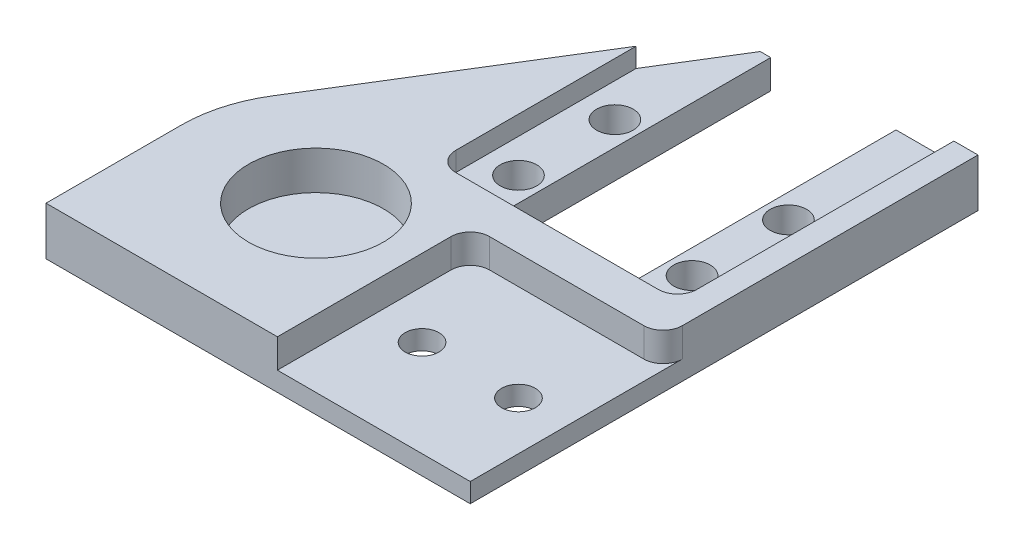
ISO-10303-21;
HEADER;
FILE_DESCRIPTION(('STEP AP214'),'2;1');
FILE_NAME('part.step','',(''),(''),'','','');
FILE_SCHEMA(('AUTOMOTIVE_DESIGN { 1 0 10303 214 1 1 1 1 }'));
ENDSEC;
DATA;
#1=APPLICATION_CONTEXT('core data for automotive mechanical design processes');
#2=APPLICATION_PROTOCOL_DEFINITION('international standard','automotive_design',2000,#1);
#3=PRODUCT_CONTEXT('',#1,'mechanical');
#4=PRODUCT('Part','Part','',(#3));
#5=PRODUCT_RELATED_PRODUCT_CATEGORY('part','',(#4));
#6=PRODUCT_DEFINITION_FORMATION('','',#4);
#7=PRODUCT_DEFINITION_CONTEXT('part definition',#1,'design');
#8=PRODUCT_DEFINITION('design','',#6,#7);
#9=PRODUCT_DEFINITION_SHAPE('','',#8);
#10=(LENGTH_UNIT() NAMED_UNIT(*) SI_UNIT(.MILLI.,.METRE.));
#11=(NAMED_UNIT(*) PLANE_ANGLE_UNIT() SI_UNIT($,.RADIAN.));
#12=(NAMED_UNIT(*) SI_UNIT($,.STERADIAN.) SOLID_ANGLE_UNIT());
#13=UNCERTAINTY_MEASURE_WITH_UNIT(LENGTH_MEASURE(1.E-05),#10,'distance_accuracy_value','');
#14=(GEOMETRIC_REPRESENTATION_CONTEXT(3) GLOBAL_UNCERTAINTY_ASSIGNED_CONTEXT((#13)) GLOBAL_UNIT_ASSIGNED_CONTEXT((#10,
#11,#12)) REPRESENTATION_CONTEXT('',''));
#15=CARTESIAN_POINT('',(0.,0.,0.));
#16=DIRECTION('',(0.,0.,1.));
#17=DIRECTION('',(1.,0.,0.));
#18=AXIS2_PLACEMENT_3D('',#15,#16,#17);
#19=CARTESIAN_POINT('',(121.75,7.,-9.));
#20=DIRECTION('',(0.,1.,0.));
#21=DIRECTION('',(0.,0.,1.));
#22=AXIS2_PLACEMENT_3D('',#19,#20,#21);
#23=PLANE('',#22);
#24=DIRECTION('',(1.,0.,0.));
#25=VECTOR('',#24,1.);
#26=CARTESIAN_POINT('',(-38.25,7.,-22.25));
#27=LINE('',#26,#25);
#28=CARTESIAN_POINT('',(-36.25,7.,-22.25));
#29=VERTEX_POINT('',#28);
#30=CARTESIAN_POINT('',(-20.25,7.,-22.25));
#31=VERTEX_POINT('',#30);
#32=EDGE_CURVE('E226',#29,#31,#27,.T.);
#33=ORIENTED_EDGE('',*,*,#32,.T.);
#34=CARTESIAN_POINT('',(-20.25,7.,-24.25));
#35=DIRECTION('',(0.,1.,0.));
#36=DIRECTION('',(0.,0.,1.));
#37=AXIS2_PLACEMENT_3D('',#34,#35,#36);
#38=CIRCLE('',#37,2.);
#39=CARTESIAN_POINT('',(-18.25,7.,-24.25));
#40=VERTEX_POINT('',#39);
#41=EDGE_CURVE('E397',#31,#40,#38,.T.);
#42=ORIENTED_EDGE('',*,*,#41,.T.);
#43=DIRECTION('',(0.,0.,-1.));
#44=VECTOR('',#43,1.);
#45=CARTESIAN_POINT('',(-18.25,7.,-8.99999999999998));
#46=LINE('',#45,#44);
#47=CARTESIAN_POINT('',(-18.25,7.,-54.9089848359276));
#48=VERTEX_POINT('',#47);
#49=EDGE_CURVE('E231',#40,#48,#46,.T.);
#50=ORIENTED_EDGE('',*,*,#49,.T.);
#51=DIRECTION('',(1.,0.,0.));
#52=VECTOR('',#51,1.);
#53=CARTESIAN_POINT('',(-62.25,7.,-54.9089848359276));
#54=LINE('',#53,#52);
#55=CARTESIAN_POINT('',(-20.75,7.,-54.9089848359276));
#56=VERTEX_POINT('',#55);
#57=EDGE_CURVE('E233',#56,#48,#54,.T.);
#58=ORIENTED_EDGE('',*,*,#57,.F.);
#59=DIRECTION('',(0.,0.,1.));
#60=VECTOR('',#59,1.);
#61=CARTESIAN_POINT('',(-20.75,7.,-9.));
#62=LINE('',#61,#60);
#63=CARTESIAN_POINT('',(-20.75,7.,-28.25));
#64=VERTEX_POINT('',#63);
#65=EDGE_CURVE('E301',#56,#64,#62,.T.);
#66=ORIENTED_EDGE('',*,*,#65,.T.);
#67=CARTESIAN_POINT('',(-22.75,7.,-28.25));
#68=DIRECTION('',(0.,1.,0.));
#69=DIRECTION('',(0.,0.,1.));
#70=AXIS2_PLACEMENT_3D('',#67,#68,#69);
#71=CIRCLE('',#70,2.);
#72=CARTESIAN_POINT('',(-22.75,7.,-26.25));
#73=VERTEX_POINT('',#72);
#74=EDGE_CURVE('E379',#64,#73,#71,.F.);
#75=ORIENTED_EDGE('',*,*,#74,.T.);
#76=DIRECTION('',(1.,0.,0.));
#77=VECTOR('',#76,1.);
#78=CARTESIAN_POINT('',(121.75,7.,-26.25));
#79=LINE('',#78,#77);
#80=CARTESIAN_POINT('',(-43.75,7.,-26.25));
#81=VERTEX_POINT('',#80);
#82=EDGE_CURVE('E330',#81,#73,#79,.T.);
#83=ORIENTED_EDGE('',*,*,#82,.F.);
#84=CARTESIAN_POINT('',(-43.75,7.,-28.25));
#85=DIRECTION('',(0.,1.,0.));
#86=DIRECTION('',(0.,0.,1.));
#87=AXIS2_PLACEMENT_3D('',#84,#85,#86);
#88=CIRCLE('',#87,2.);
#89=CARTESIAN_POINT('',(-45.75,7.,-28.25));
#90=VERTEX_POINT('',#89);
#91=EDGE_CURVE('E390',#81,#90,#88,.F.);
#92=ORIENTED_EDGE('',*,*,#91,.T.);
#93=DIRECTION('',(0.,0.,-1.));
#94=VECTOR('',#93,1.);
#95=CARTESIAN_POINT('',(-45.75,7.,-9.));
#96=LINE('',#95,#94);
#97=CARTESIAN_POINT('',(-45.75,7.,-46.9436745409189));
#98=VERTEX_POINT('',#97);
#99=EDGE_CURVE('E352',#90,#98,#96,.T.);
#100=ORIENTED_EDGE('',*,*,#99,.T.);
#101=DIRECTION('',(-0.525421149026402,0.,0.850842298052803));
#102=VECTOR('',#101,1.);
#103=CARTESIAN_POINT('',(-34.4694758388832,7.,-65.2108248417198));
#104=LINE('',#103,#102);
#105=CARTESIAN_POINT('',(-60.1617921727393,7.,-23.6058960863696));
#106=VERTEX_POINT('',#105);
#107=EDGE_CURVE('E338',#98,#106,#104,.T.);
#108=ORIENTED_EDGE('',*,*,#107,.T.);
#109=CARTESIAN_POINT('',(-48.25,7.,-16.25));
#110=DIRECTION('',(0.,1.,0.));
#111=DIRECTION('',(0.,0.,1.));
#112=AXIS2_PLACEMENT_3D('',#109,#110,#111);
#113=CIRCLE('',#112,14.);
#114=CARTESIAN_POINT('',(-62.25,7.,-16.25));
#115=VERTEX_POINT('',#114);
#116=EDGE_CURVE('E340',#106,#115,#113,.T.);
#117=ORIENTED_EDGE('',*,*,#116,.T.);
#118=DIRECTION('',(0.,0.,1.));
#119=VECTOR('',#118,1.);
#120=CARTESIAN_POINT('',(-62.25,7.,-16.25));
#121=LINE('',#120,#119);
#122=CARTESIAN_POINT('',(-62.25,7.,-2.25));
#123=VERTEX_POINT('',#122);
#124=EDGE_CURVE('E333',#115,#123,#121,.T.);
#125=ORIENTED_EDGE('',*,*,#124,.T.);
#126=DIRECTION('',(1.,0.,0.));
#127=VECTOR('',#126,1.);
#128=CARTESIAN_POINT('',(-62.25,7.,-2.25));
#129=LINE('',#128,#127);
#130=CARTESIAN_POINT('',(-38.25,7.,-2.24999999999999));
#131=VERTEX_POINT('',#130);
#132=EDGE_CURVE('E336',#123,#131,#129,.T.);
#133=ORIENTED_EDGE('',*,*,#132,.T.);
#134=DIRECTION('',(0.,0.,1.));
#135=VECTOR('',#134,1.);
#136=CARTESIAN_POINT('',(-38.25,7.,-2.24999999999999));
#137=LINE('',#136,#135);
#138=CARTESIAN_POINT('',(-38.25,7.,-20.25));
#139=VERTEX_POINT('',#138);
#140=EDGE_CURVE('E209',#139,#131,#137,.T.);
#141=ORIENTED_EDGE('',*,*,#140,.F.);
#142=CARTESIAN_POINT('',(-36.25,7.,-20.25));
#143=DIRECTION('',(0.,1.,0.));
#144=DIRECTION('',(0.,0.,1.));
#145=AXIS2_PLACEMENT_3D('',#142,#143,#144);
#146=CIRCLE('',#145,2.);
#147=EDGE_CURVE('E12',#139,#29,#146,.F.);
#148=ORIENTED_EDGE('',*,*,#147,.T.);
#149=EDGE_LOOP('',(#33,#42,#50,#58,#66,#75,#83,#92,#100,#108,#117,#125,#133,#141,#148));
#150=FACE_BOUND('',#149,.T.);
#151=CARTESIAN_POINT('',(-48.25,7.,-16.25));
#152=DIRECTION('',(0.,1.,0.));
#153=DIRECTION('',(0.,0.,1.));
#154=AXIS2_PLACEMENT_3D('',#151,#152,#153);
#155=CIRCLE('',#154,7.);
#156=CARTESIAN_POINT('',(-48.25,7.,-9.25));
#157=VERTEX_POINT('',#156);
#158=EDGE_CURVE('E282',#157,#157,#155,.T.);
#159=ORIENTED_EDGE('',*,*,#158,.F.);
#160=EDGE_LOOP('',(#159));
#161=FACE_BOUND('',#160,.T.);
#162=ADVANCED_FACE('F50',(#150,#161),#23,.T.);
#163=CARTESIAN_POINT('',(0.,4.,-2.25));
#164=DIRECTION('',(0.,0.,-1.));
#165=DIRECTION('',(-1.,0.,0.));
#166=AXIS2_PLACEMENT_3D('',#163,#164,#165);
#167=PLANE('',#166);
#168=DIRECTION('',(0.,1.,0.));
#169=VECTOR('',#168,1.);
#170=CARTESIAN_POINT('',(-18.25,2.,-2.25));
#171=LINE('',#170,#169);
#172=CARTESIAN_POINT('',(-18.25,2.,-2.25));
#173=VERTEX_POINT('',#172);
#174=CARTESIAN_POINT('',(-18.25,4.,-2.25));
#175=VERTEX_POINT('',#174);
#176=EDGE_CURVE('E222',#173,#175,#171,.T.);
#177=ORIENTED_EDGE('',*,*,#176,.T.);
#178=DIRECTION('',(1.,0.,0.));
#179=VECTOR('',#178,1.);
#180=CARTESIAN_POINT('',(-38.25,4.,-2.25));
#181=LINE('',#180,#179);
#182=CARTESIAN_POINT('',(-38.25,4.,-2.25));
#183=VERTEX_POINT('',#182);
#184=EDGE_CURVE('E205',#183,#175,#181,.T.);
#185=ORIENTED_EDGE('',*,*,#184,.F.);
#186=DIRECTION('',(0.,-1.,0.));
#187=VECTOR('',#186,1.);
#188=CARTESIAN_POINT('',(-38.25,7.,-2.24999999999999));
#189=LINE('',#188,#187);
#190=EDGE_CURVE('E210',#131,#183,#189,.T.);
#191=ORIENTED_EDGE('',*,*,#190,.F.);
#192=ORIENTED_EDGE('',*,*,#132,.F.);
#193=DIRECTION('',(0.,-1.,0.));
#194=VECTOR('',#193,1.);
#195=CARTESIAN_POINT('',(-62.25,7.,-2.25));
#196=LINE('',#195,#194);
#197=CARTESIAN_POINT('',(-62.25,2.,-2.25));
#198=VERTEX_POINT('',#197);
#199=EDGE_CURVE('E343',#123,#198,#196,.T.);
#200=ORIENTED_EDGE('',*,*,#199,.T.);
#201=DIRECTION('',(-1.,0.,0.));
#202=VECTOR('',#201,1.);
#203=CARTESIAN_POINT('',(0.,2.,-2.25));
#204=LINE('',#203,#202);
#205=EDGE_CURVE('E317',#173,#198,#204,.T.);
#206=ORIENTED_EDGE('',*,*,#205,.F.);
#207=EDGE_LOOP('',(#177,#185,#191,#192,#200,#206));
#208=FACE_BOUND('',#207,.T.);
#209=ADVANCED_FACE('F219',(#208),#167,.F.);
#210=CARTESIAN_POINT('',(-26.75,23.,-64.4306069155303));
#211=DIRECTION('',(1.,0.,0.));
#212=DIRECTION('',(0.,0.,-1.));
#213=AXIS2_PLACEMENT_3D('',#210,#211,#212);
#214=PLANE('',#213);
#215=DIRECTION('',(0.,0.,-1.));
#216=VECTOR('',#215,1.);
#217=CARTESIAN_POINT('',(-26.75,2.,0.));
#218=LINE('',#217,#216);
#219=CARTESIAN_POINT('',(-26.75,2.,-28.25));
#220=VERTEX_POINT('',#219);
#221=CARTESIAN_POINT('',(-26.75,2.,-54.9089848359276));
#222=VERTEX_POINT('',#221);
#223=EDGE_CURVE('E313',#220,#222,#218,.T.);
#224=ORIENTED_EDGE('',*,*,#223,.F.);
#225=DIRECTION('',(0.,-1.,0.));
#226=VECTOR('',#225,1.);
#227=CARTESIAN_POINT('',(-26.75,5.,-28.25));
#228=LINE('',#227,#226);
#229=CARTESIAN_POINT('',(-26.75,5.,-28.25));
#230=VERTEX_POINT('',#229);
#231=EDGE_CURVE('E369',#220,#230,#228,.F.);
#232=ORIENTED_EDGE('',*,*,#231,.T.);
#233=DIRECTION('',(0.,0.,1.));
#234=VECTOR('',#233,1.);
#235=CARTESIAN_POINT('',(-26.75,5.,-64.4306069155303));
#236=LINE('',#235,#234);
#237=CARTESIAN_POINT('',(-26.75,5.,-54.9089848359276));
#238=VERTEX_POINT('',#237);
#239=EDGE_CURVE('E349',#238,#230,#236,.T.);
#240=ORIENTED_EDGE('',*,*,#239,.F.);
#241=DIRECTION('',(0.,1.,0.));
#242=VECTOR('',#241,1.);
#243=CARTESIAN_POINT('',(-26.75,23.,-54.9089848359276));
#244=LINE('',#243,#242);
#245=EDGE_CURVE('E254',#222,#238,#244,.T.);
#246=ORIENTED_EDGE('',*,*,#245,.F.);
#247=EDGE_LOOP('',(#224,#232,#240,#246));
#248=FACE_BOUND('',#247,.T.);
#249=ADVANCED_FACE('F505',(#248),#214,.F.);
#250=CARTESIAN_POINT('',(0.,2.,0.));
#251=DIRECTION('',(0.,-1.,0.));
#252=DIRECTION('',(0.,0.,-1.));
#253=AXIS2_PLACEMENT_3D('',#250,#251,#252);
#254=PLANE('',#253);
#255=CARTESIAN_POINT('',(-33.25,2.,-12.25));
#256=DIRECTION('',(0.,-1.,0.));
#257=DIRECTION('',(0.,0.,-1.));
#258=AXIS2_PLACEMENT_3D('',#255,#256,#257);
#259=CIRCLE('',#258,1.75);
#260=CARTESIAN_POINT('',(-33.25,2.,-14.));
#261=VERTEX_POINT('',#260);
#262=EDGE_CURVE('E465',#261,#261,#259,.T.);
#263=ORIENTED_EDGE('',*,*,#262,.F.);
#264=EDGE_LOOP('',(#263));
#265=FACE_BOUND('',#264,.T.);
#266=CARTESIAN_POINT('',(-23.25,2.,-12.25));
#267=DIRECTION('',(0.,-1.,0.));
#268=DIRECTION('',(0.,0.,-1.));
#269=AXIS2_PLACEMENT_3D('',#266,#267,#268);
#270=CIRCLE('',#269,1.75);
#271=CARTESIAN_POINT('',(-23.25,2.,-14.));
#272=VERTEX_POINT('',#271);
#273=EDGE_CURVE('E468',#272,#272,#270,.T.);
#274=ORIENTED_EDGE('',*,*,#273,.F.);
#275=EDGE_LOOP('',(#274));
#276=FACE_BOUND('',#275,.T.);
#277=CARTESIAN_POINT('',(-42.25,2.,-31.25));
#278=DIRECTION('',(0.,-1.,0.));
#279=DIRECTION('',(0.,0.,-1.));
#280=AXIS2_PLACEMENT_3D('',#277,#278,#279);
#281=CIRCLE('',#280,1.89681297848375);
#282=CARTESIAN_POINT('',(-42.25,2.,-33.1468129784838));
#283=VERTEX_POINT('',#282);
#284=EDGE_CURVE('E273',#283,#283,#281,.T.);
#285=ORIENTED_EDGE('',*,*,#284,.F.);
#286=EDGE_LOOP('',(#285));
#287=FACE_BOUND('',#286,.T.);
#288=CARTESIAN_POINT('',(-24.25,2.,-41.25));
#289=DIRECTION('',(0.,-1.,0.));
#290=DIRECTION('',(0.,0.,-1.));
#291=AXIS2_PLACEMENT_3D('',#288,#289,#290);
#292=CIRCLE('',#291,1.89681297848375);
#293=CARTESIAN_POINT('',(-24.25,2.,-43.1468129784838));
#294=VERTEX_POINT('',#293);
#295=EDGE_CURVE('E279',#294,#294,#292,.T.);
#296=ORIENTED_EDGE('',*,*,#295,.F.);
#297=EDGE_LOOP('',(#296));
#298=FACE_BOUND('',#297,.T.);
#299=CARTESIAN_POINT('',(-24.25,2.,-31.25));
#300=DIRECTION('',(0.,-1.,0.));
#301=DIRECTION('',(0.,0.,-1.));
#302=AXIS2_PLACEMENT_3D('',#299,#300,#301);
#303=CIRCLE('',#302,1.89681297848375);
#304=CARTESIAN_POINT('',(-24.25,2.,-33.1468129784838));
#305=VERTEX_POINT('',#304);
#306=EDGE_CURVE('E276',#305,#305,#303,.T.);
#307=ORIENTED_EDGE('',*,*,#306,.F.);
#308=EDGE_LOOP('',(#307));
#309=FACE_BOUND('',#308,.T.);
#310=CARTESIAN_POINT('',(-42.25,2.,-41.25));
#311=DIRECTION('',(0.,-1.,0.));
#312=DIRECTION('',(0.,0.,-1.));
#313=AXIS2_PLACEMENT_3D('',#310,#311,#312);
#314=CIRCLE('',#313,1.89681297848375);
#315=CARTESIAN_POINT('',(-42.25,2.,-43.1468129784838));
#316=VERTEX_POINT('',#315);
#317=EDGE_CURVE('E270',#316,#316,#314,.T.);
#318=ORIENTED_EDGE('',*,*,#317,.F.);
#319=EDGE_LOOP('',(#318));
#320=FACE_BOUND('',#319,.T.);
#321=DIRECTION('',(0.525421149026402,0.,-0.850842298052804));
#322=VECTOR('',#321,1.);
#323=CARTESIAN_POINT('',(-54.1061121428569,2.,-33.4121795267011));
#324=LINE('',#323,#322);
#325=CARTESIAN_POINT('',(-60.1617921727393,2.,-23.6058960863696));
#326=VERTEX_POINT('',#325);
#327=CARTESIAN_POINT('',(-40.8311772085929,2.,-54.9089848359276));
#328=VERTEX_POINT('',#327);
#329=EDGE_CURVE('E326',#326,#328,#324,.T.);
#330=ORIENTED_EDGE('',*,*,#329,.T.);
#331=DIRECTION('',(1.,0.,0.));
#332=VECTOR('',#331,1.);
#333=CARTESIAN_POINT('',(0.,2.,-54.9089848359276));
#334=LINE('',#333,#332);
#335=CARTESIAN_POINT('',(-39.75,2.,-54.9089848359276));
#336=VERTEX_POINT('',#335);
#337=EDGE_CURVE('E244',#328,#336,#334,.T.);
#338=ORIENTED_EDGE('',*,*,#337,.T.);
#339=DIRECTION('',(0.,0.,1.));
#340=VECTOR('',#339,1.);
#341=CARTESIAN_POINT('',(-39.75,2.,0.));
#342=LINE('',#341,#340);
#343=CARTESIAN_POINT('',(-39.75,2.,-28.25));
#344=VERTEX_POINT('',#343);
#345=EDGE_CURVE('E307',#336,#344,#342,.T.);
#346=ORIENTED_EDGE('',*,*,#345,.T.);
#347=CARTESIAN_POINT('',(-37.75,2.,-28.25));
#348=DIRECTION('',(0.,-1.,0.));
#349=DIRECTION('',(0.,0.,-1.));
#350=AXIS2_PLACEMENT_3D('',#347,#348,#349);
#351=CIRCLE('',#350,2.);
#352=CARTESIAN_POINT('',(-37.75,2.,-26.25));
#353=VERTEX_POINT('',#352);
#354=EDGE_CURVE('E386',#344,#353,#351,.F.);
#355=ORIENTED_EDGE('',*,*,#354,.T.);
#356=DIRECTION('',(1.,0.,0.));
#357=VECTOR('',#356,1.);
#358=CARTESIAN_POINT('',(0.,2.,-26.25));
#359=LINE('',#358,#357);
#360=CARTESIAN_POINT('',(-28.75,2.,-26.25));
#361=VERTEX_POINT('',#360);
#362=EDGE_CURVE('E310',#353,#361,#359,.T.);
#363=ORIENTED_EDGE('',*,*,#362,.T.);
#364=CARTESIAN_POINT('',(-28.75,2.,-28.25));
#365=DIRECTION('',(0.,-1.,0.));
#366=DIRECTION('',(0.,0.,-1.));
#367=AXIS2_PLACEMENT_3D('',#364,#365,#366);
#368=CIRCLE('',#367,2.);
#369=EDGE_CURVE('E381',#361,#220,#368,.F.);
#370=ORIENTED_EDGE('',*,*,#369,.T.);
#371=ORIENTED_EDGE('',*,*,#223,.T.);
#372=CARTESIAN_POINT('',(-18.25,2.,-54.9089848359276));
#373=VERTEX_POINT('',#372);
#374=EDGE_CURVE('E248',#222,#373,#334,.T.);
#375=ORIENTED_EDGE('',*,*,#374,.T.);
#376=DIRECTION('',(0.,0.,1.));
#377=VECTOR('',#376,1.);
#378=CARTESIAN_POINT('',(-18.25,2.,0.));
#379=LINE('',#378,#377);
#380=EDGE_CURVE('E315',#373,#173,#379,.T.);
#381=ORIENTED_EDGE('',*,*,#380,.T.);
#382=ORIENTED_EDGE('',*,*,#205,.T.);
#383=DIRECTION('',(0.,0.,-1.));
#384=VECTOR('',#383,1.);
#385=CARTESIAN_POINT('',(-62.25,2.,0.));
#386=LINE('',#385,#384);
#387=CARTESIAN_POINT('',(-62.25,2.,-16.25));
#388=VERTEX_POINT('',#387);
#389=EDGE_CURVE('E320',#198,#388,#386,.T.);
#390=ORIENTED_EDGE('',*,*,#389,.T.);
#391=CARTESIAN_POINT('',(-48.25,2.,-16.25));
#392=DIRECTION('',(0.,-1.,0.));
#393=DIRECTION('',(0.,0.,-1.));
#394=AXIS2_PLACEMENT_3D('',#391,#392,#393);
#395=CIRCLE('',#394,14.);
#396=EDGE_CURVE('E323',#388,#326,#395,.T.);
#397=ORIENTED_EDGE('',*,*,#396,.T.);
#398=EDGE_LOOP('',(#330,#338,#346,#355,#363,#370,#371,#375,#381,#382,#390,#397));
#399=FACE_BOUND('',#398,.T.);
#400=ADVANCED_FACE('F463',(#265,#276,#287,#298,#309,#320,#399),#254,.T.);
#401=CARTESIAN_POINT('',(0.,5.,0.));
#402=DIRECTION('',(0.,1.,0.));
#403=DIRECTION('',(0.,0.,1.));
#404=AXIS2_PLACEMENT_3D('',#401,#402,#403);
#405=PLANE('',#404);
#406=CARTESIAN_POINT('',(-24.25,5.,-41.25));
#407=DIRECTION('',(0.,1.,0.));
#408=DIRECTION('',(0.,0.,1.));
#409=AXIS2_PLACEMENT_3D('',#406,#407,#408);
#410=CIRCLE('',#409,1.89681297848375);
#411=CARTESIAN_POINT('',(-24.25,5.,-39.3531870215162));
#412=VERTEX_POINT('',#411);
#413=EDGE_CURVE('E261',#412,#412,#410,.T.);
#414=ORIENTED_EDGE('',*,*,#413,.F.);
#415=EDGE_LOOP('',(#414));
#416=FACE_BOUND('',#415,.T.);
#417=CARTESIAN_POINT('',(-24.25,5.,-31.25));
#418=DIRECTION('',(0.,1.,0.));
#419=DIRECTION('',(0.,0.,1.));
#420=AXIS2_PLACEMENT_3D('',#417,#418,#419);
#421=CIRCLE('',#420,1.89681297848375);
#422=CARTESIAN_POINT('',(-24.25,5.,-29.3531870215162));
#423=VERTEX_POINT('',#422);
#424=EDGE_CURVE('E258',#423,#423,#421,.T.);
#425=ORIENTED_EDGE('',*,*,#424,.F.);
#426=EDGE_LOOP('',(#425));
#427=FACE_BOUND('',#426,.T.);
#428=DIRECTION('',(1.,0.,0.));
#429=VECTOR('',#428,1.);
#430=CARTESIAN_POINT('',(-45.75,5.,-26.25));
#431=LINE('',#430,#429);
#432=CARTESIAN_POINT('',(-28.75,5.,-26.25));
#433=VERTEX_POINT('',#432);
#434=CARTESIAN_POINT('',(-22.75,5.,-26.25));
#435=VERTEX_POINT('',#434);
#436=EDGE_CURVE('E293',#433,#435,#431,.T.);
#437=ORIENTED_EDGE('',*,*,#436,.T.);
#438=CARTESIAN_POINT('',(-22.75,5.,-28.25));
#439=DIRECTION('',(0.,1.,0.));
#440=DIRECTION('',(0.,0.,1.));
#441=AXIS2_PLACEMENT_3D('',#438,#439,#440);
#442=CIRCLE('',#441,2.);
#443=CARTESIAN_POINT('',(-20.75,5.,-28.25));
#444=VERTEX_POINT('',#443);
#445=EDGE_CURVE('E365',#435,#444,#442,.T.);
#446=ORIENTED_EDGE('',*,*,#445,.T.);
#447=DIRECTION('',(0.,0.,-1.));
#448=VECTOR('',#447,1.);
#449=CARTESIAN_POINT('',(-20.75,5.,-26.25));
#450=LINE('',#449,#448);
#451=CARTESIAN_POINT('',(-20.75,5.,-54.9089848359276));
#452=VERTEX_POINT('',#451);
#453=EDGE_CURVE('E286',#444,#452,#450,.T.);
#454=ORIENTED_EDGE('',*,*,#453,.T.);
#455=DIRECTION('',(-1.,0.,0.));
#456=VECTOR('',#455,1.);
#457=CARTESIAN_POINT('',(0.,5.,-54.9089848359276));
#458=LINE('',#457,#456);
#459=EDGE_CURVE('E251',#452,#238,#458,.T.);
#460=ORIENTED_EDGE('',*,*,#459,.T.);
#461=ORIENTED_EDGE('',*,*,#239,.T.);
#462=CARTESIAN_POINT('',(-28.75,5.,-28.25));
#463=DIRECTION('',(0.,1.,0.));
#464=DIRECTION('',(0.,0.,1.));
#465=AXIS2_PLACEMENT_3D('',#462,#463,#464);
#466=CIRCLE('',#465,2.);
#467=EDGE_CURVE('E383',#230,#433,#466,.F.);
#468=ORIENTED_EDGE('',*,*,#467,.T.);
#469=EDGE_LOOP('',(#437,#446,#454,#460,#461,#468));
#470=FACE_BOUND('',#469,.T.);
#471=ADVANCED_FACE('F692',(#416,#427,#470),#405,.T.);
#472=CARTESIAN_POINT('',(-20.75,23.,-26.25));
#473=DIRECTION('',(-1.,0.,0.));
#474=DIRECTION('',(0.,0.,1.));
#475=AXIS2_PLACEMENT_3D('',#472,#473,#474);
#476=PLANE('',#475);
#477=ORIENTED_EDGE('',*,*,#453,.F.);
#478=DIRECTION('',(0.,-1.,0.));
#479=VECTOR('',#478,1.);
#480=CARTESIAN_POINT('',(-20.75,23.,-28.25));
#481=LINE('',#480,#479);
#482=EDGE_CURVE('E367',#444,#64,#481,.F.);
#483=ORIENTED_EDGE('',*,*,#482,.T.);
#484=ORIENTED_EDGE('',*,*,#65,.F.);
#485=DIRECTION('',(0.,-1.,0.));
#486=VECTOR('',#485,1.);
#487=CARTESIAN_POINT('',(-20.75,23.,-54.9089848359276));
#488=LINE('',#487,#486);
#489=EDGE_CURVE('E247',#56,#452,#488,.T.);
#490=ORIENTED_EDGE('',*,*,#489,.T.);
#491=EDGE_LOOP('',(#477,#483,#484,#490));
#492=FACE_BOUND('',#491,.T.);
#493=ADVANCED_FACE('F430',(#492),#476,.T.);
#494=CARTESIAN_POINT('',(-54.1061121428569,4.,-33.4121795267011));
#495=DIRECTION('',(-0.850842298052804,0.,-0.525421149026402));
#496=DIRECTION('',(-0.525421149026402,0.,0.850842298052804));
#497=AXIS2_PLACEMENT_3D('',#494,#495,#496);
#498=PLANE('',#497);
#499=DIRECTION('',(0.525421149026402,0.,-0.850842298052804));
#500=VECTOR('',#499,1.);
#501=CARTESIAN_POINT('',(-54.1061121428569,5.,-33.4121795267011));
#502=LINE('',#501,#500);
#503=CARTESIAN_POINT('',(-45.75,5.,-46.9436745409189));
#504=VERTEX_POINT('',#503);
#505=CARTESIAN_POINT('',(-40.8311772085929,5.,-54.9089848359276));
#506=VERTEX_POINT('',#505);
#507=EDGE_CURVE('E298',#504,#506,#502,.T.);
#508=ORIENTED_EDGE('',*,*,#507,.T.);
#509=DIRECTION('',(0.,-1.,0.));
#510=VECTOR('',#509,1.);
#511=CARTESIAN_POINT('',(-40.8311772085929,4.,-54.9089848359276));
#512=LINE('',#511,#510);
#513=EDGE_CURVE('E241',#506,#328,#512,.T.);
#514=ORIENTED_EDGE('',*,*,#513,.T.);
#515=ORIENTED_EDGE('',*,*,#329,.F.);
#516=DIRECTION('',(0.,-1.,0.));
#517=VECTOR('',#516,1.);
#518=CARTESIAN_POINT('',(-60.1617921727393,4.,-23.6058960863696));
#519=LINE('',#518,#517);
#520=EDGE_CURVE('E347',#106,#326,#519,.T.);
#521=ORIENTED_EDGE('',*,*,#520,.F.);
#522=ORIENTED_EDGE('',*,*,#107,.F.);
#523=DIRECTION('',(0.,-1.,0.));
#524=VECTOR('',#523,1.);
#525=CARTESIAN_POINT('',(-45.75,4.,-46.9436745409189));
#526=LINE('',#525,#524);
#527=EDGE_CURVE('E304',#98,#504,#526,.T.);
#528=ORIENTED_EDGE('',*,*,#527,.T.);
#529=EDGE_LOOP('',(#508,#514,#515,#521,#522,#528));
#530=FACE_BOUND('',#529,.T.);
#531=ADVANCED_FACE('F453',(#530),#498,.T.);
#532=CARTESIAN_POINT('',(-39.75,23.,-26.25));
#533=DIRECTION('',(-1.,0.,0.));
#534=DIRECTION('',(0.,0.,1.));
#535=AXIS2_PLACEMENT_3D('',#532,#533,#534);
#536=PLANE('',#535);
#537=DIRECTION('',(0.,0.,-1.));
#538=VECTOR('',#537,1.);
#539=CARTESIAN_POINT('',(-39.75,5.,-26.25));
#540=LINE('',#539,#538);
#541=CARTESIAN_POINT('',(-39.75,5.,-28.25));
#542=VERTEX_POINT('',#541);
#543=CARTESIAN_POINT('',(-39.75,5.,-54.9089848359276));
#544=VERTEX_POINT('',#543);
#545=EDGE_CURVE('E296',#542,#544,#540,.T.);
#546=ORIENTED_EDGE('',*,*,#545,.F.);
#547=DIRECTION('',(0.,-1.,0.));
#548=VECTOR('',#547,1.);
#549=CARTESIAN_POINT('',(-39.75,2.,-28.25));
#550=LINE('',#549,#548);
#551=EDGE_CURVE('E371',#542,#344,#550,.T.);
#552=ORIENTED_EDGE('',*,*,#551,.T.);
#553=ORIENTED_EDGE('',*,*,#345,.F.);
#554=DIRECTION('',(0.,-1.,0.));
#555=VECTOR('',#554,1.);
#556=CARTESIAN_POINT('',(-39.75,23.,-54.9089848359276));
#557=LINE('',#556,#555);
#558=EDGE_CURVE('E239',#544,#336,#557,.T.);
#559=ORIENTED_EDGE('',*,*,#558,.F.);
#560=EDGE_LOOP('',(#546,#552,#553,#559));
#561=FACE_BOUND('',#560,.T.);
#562=ADVANCED_FACE('F516',(#561),#536,.F.);
#563=CARTESIAN_POINT('',(-42.25,5.,-31.25));
#564=DIRECTION('',(0.,1.,0.));
#565=DIRECTION('',(0.,0.,1.));
#566=AXIS2_PLACEMENT_3D('',#563,#564,#565);
#567=CIRCLE('',#566,1.89681297848375);
#568=CARTESIAN_POINT('',(-42.25,5.,-29.3531870215162));
#569=VERTEX_POINT('',#568);
#570=EDGE_CURVE('E262',#569,#569,#567,.T.);
#571=ORIENTED_EDGE('',*,*,#570,.F.);
#572=EDGE_LOOP('',(#571));
#573=FACE_BOUND('',#572,.T.);
#574=CARTESIAN_POINT('',(-42.25,5.,-41.25));
#575=DIRECTION('',(0.,1.,0.));
#576=DIRECTION('',(0.,0.,1.));
#577=AXIS2_PLACEMENT_3D('',#574,#575,#576);
#578=CIRCLE('',#577,1.89681297848375);
#579=CARTESIAN_POINT('',(-42.25,5.,-39.3531870215162));
#580=VERTEX_POINT('',#579);
#581=EDGE_CURVE('E265',#580,#580,#578,.T.);
#582=ORIENTED_EDGE('',*,*,#581,.F.);
#583=EDGE_LOOP('',(#582));
#584=FACE_BOUND('',#583,.T.);
#585=DIRECTION('',(0.,0.,1.));
#586=VECTOR('',#585,1.);
#587=CARTESIAN_POINT('',(-45.75,5.,-26.25));
#588=LINE('',#587,#586);
#589=CARTESIAN_POINT('',(-45.75,5.,-28.25));
#590=VERTEX_POINT('',#589);
#591=EDGE_CURVE('E290',#504,#590,#588,.T.);
#592=ORIENTED_EDGE('',*,*,#591,.T.);
#593=CARTESIAN_POINT('',(-43.75,5.,-28.25));
#594=DIRECTION('',(0.,1.,0.));
#595=DIRECTION('',(0.,0.,1.));
#596=AXIS2_PLACEMENT_3D('',#593,#594,#595);
#597=CIRCLE('',#596,2.);
#598=CARTESIAN_POINT('',(-43.75,5.,-26.25));
#599=VERTEX_POINT('',#598);
#600=EDGE_CURVE('E377',#590,#599,#597,.T.);
#601=ORIENTED_EDGE('',*,*,#600,.T.);
#602=CARTESIAN_POINT('',(-37.75,5.,-26.25));
#603=VERTEX_POINT('',#602);
#604=EDGE_CURVE('E294',#599,#603,#431,.T.);
#605=ORIENTED_EDGE('',*,*,#604,.T.);
#606=CARTESIAN_POINT('',(-37.75,5.,-28.25));
#607=DIRECTION('',(0.,1.,0.));
#608=DIRECTION('',(0.,0.,1.));
#609=AXIS2_PLACEMENT_3D('',#606,#607,#608);
#610=CIRCLE('',#609,2.);
#611=EDGE_CURVE('E388',#603,#542,#610,.F.);
#612=ORIENTED_EDGE('',*,*,#611,.T.);
#613=ORIENTED_EDGE('',*,*,#545,.T.);
#614=DIRECTION('',(-1.,0.,0.));
#615=VECTOR('',#614,1.);
#616=CARTESIAN_POINT('',(0.,5.,-54.9089848359276));
#617=LINE('',#616,#615);
#618=EDGE_CURVE('E236',#544,#506,#617,.T.);
#619=ORIENTED_EDGE('',*,*,#618,.T.);
#620=ORIENTED_EDGE('',*,*,#507,.F.);
#621=EDGE_LOOP('',(#592,#601,#605,#612,#613,#619,#620));
#622=FACE_BOUND('',#621,.T.);
#623=ADVANCED_FACE('F571',(#573,#584,#622),#405,.T.);
#624=CARTESIAN_POINT('',(-18.25,2.,0.));
#625=DIRECTION('',(-1.,0.,0.));
#626=DIRECTION('',(0.,0.,1.));
#627=AXIS2_PLACEMENT_3D('',#624,#625,#626);
#628=PLANE('',#627);
#629=ORIENTED_EDGE('',*,*,#49,.F.);
#630=DIRECTION('',(0.,1.,0.));
#631=VECTOR('',#630,1.);
#632=CARTESIAN_POINT('',(-18.25,2.,-24.25));
#633=LINE('',#632,#631);
#634=CARTESIAN_POINT('',(-18.25,4.,-24.25));
#635=VERTEX_POINT('',#634);
#636=EDGE_CURVE('E399',#40,#635,#633,.F.);
#637=ORIENTED_EDGE('',*,*,#636,.T.);
#638=DIRECTION('',(0.,0.,-1.));
#639=VECTOR('',#638,1.);
#640=CARTESIAN_POINT('',(-18.25,4.,-2.25));
#641=LINE('',#640,#639);
#642=EDGE_CURVE('E72',#175,#635,#641,.T.);
#643=ORIENTED_EDGE('',*,*,#642,.F.);
#644=ORIENTED_EDGE('',*,*,#176,.F.);
#645=ORIENTED_EDGE('',*,*,#380,.F.);
#646=DIRECTION('',(0.,-1.,0.));
#647=VECTOR('',#646,1.);
#648=CARTESIAN_POINT('',(-18.25,2.,-54.9089848359276));
#649=LINE('',#648,#647);
#650=EDGE_CURVE('E256',#48,#373,#649,.T.);
#651=ORIENTED_EDGE('',*,*,#650,.F.);
#652=EDGE_LOOP('',(#629,#637,#643,#644,#645,#651));
#653=FACE_BOUND('',#652,.T.);
#654=ADVANCED_FACE('F419',(#653),#628,.F.);
#655=CARTESIAN_POINT('',(-48.25,4.,-16.25));
#656=DIRECTION('',(0.,-1.,0.));
#657=DIRECTION('',(0.,0.,-1.));
#658=AXIS2_PLACEMENT_3D('',#655,#656,#657);
#659=CYLINDRICAL_SURFACE('',#658,14.);
#660=ORIENTED_EDGE('',*,*,#520,.T.);
#661=ORIENTED_EDGE('',*,*,#396,.F.);
#662=DIRECTION('',(0.,-1.,0.));
#663=VECTOR('',#662,1.);
#664=CARTESIAN_POINT('',(-62.25,4.,-16.25));
#665=LINE('',#664,#663);
#666=EDGE_CURVE('E345',#115,#388,#665,.T.);
#667=ORIENTED_EDGE('',*,*,#666,.F.);
#668=ORIENTED_EDGE('',*,*,#116,.F.);
#669=EDGE_LOOP('',(#660,#661,#667,#668));
#670=FACE_BOUND('',#669,.T.);
#671=ADVANCED_FACE('F512',(#670),#659,.T.);
#672=CARTESIAN_POINT('',(-62.25,4.,0.));
#673=DIRECTION('',(1.,0.,0.));
#674=DIRECTION('',(0.,0.,-1.));
#675=AXIS2_PLACEMENT_3D('',#672,#673,#674);
#676=PLANE('',#675);
#677=ORIENTED_EDGE('',*,*,#666,.T.);
#678=ORIENTED_EDGE('',*,*,#389,.F.);
#679=ORIENTED_EDGE('',*,*,#199,.F.);
#680=ORIENTED_EDGE('',*,*,#124,.F.);
#681=EDGE_LOOP('',(#677,#678,#679,#680));
#682=FACE_BOUND('',#681,.T.);
#683=ADVANCED_FACE('F460',(#682),#676,.F.);
#684=CARTESIAN_POINT('',(-26.75,23.,-26.25));
#685=DIRECTION('',(0.,0.,1.));
#686=DIRECTION('',(1.,0.,0.));
#687=AXIS2_PLACEMENT_3D('',#684,#685,#686);
#688=PLANE('',#687);
#689=ORIENTED_EDGE('',*,*,#82,.T.);
#690=DIRECTION('',(0.,-1.,0.));
#691=VECTOR('',#690,1.);
#692=CARTESIAN_POINT('',(-22.75,23.,-26.25));
#693=LINE('',#692,#691);
#694=EDGE_CURVE('E362',#73,#435,#693,.T.);
#695=ORIENTED_EDGE('',*,*,#694,.T.);
#696=ORIENTED_EDGE('',*,*,#436,.F.);
#697=DIRECTION('',(0.,-1.,0.));
#698=VECTOR('',#697,1.);
#699=CARTESIAN_POINT('',(-28.75,2.,-26.25));
#700=LINE('',#699,#698);
#701=EDGE_CURVE('E359',#433,#361,#700,.T.);
#702=ORIENTED_EDGE('',*,*,#701,.T.);
#703=ORIENTED_EDGE('',*,*,#362,.F.);
#704=DIRECTION('',(0.,-1.,0.));
#705=VECTOR('',#704,1.);
#706=CARTESIAN_POINT('',(-37.75,5.00000000000001,-26.25));
#707=LINE('',#706,#705);
#708=EDGE_CURVE('E356',#353,#603,#707,.F.);
#709=ORIENTED_EDGE('',*,*,#708,.T.);
#710=ORIENTED_EDGE('',*,*,#604,.F.);
#711=DIRECTION('',(0.,-1.,0.));
#712=VECTOR('',#711,1.);
#713=CARTESIAN_POINT('',(-43.75,23.,-26.25));
#714=LINE('',#713,#712);
#715=EDGE_CURVE('E354',#599,#81,#714,.F.);
#716=ORIENTED_EDGE('',*,*,#715,.T.);
#717=EDGE_LOOP('',(#689,#695,#696,#702,#703,#709,#710,#716));
#718=FACE_BOUND('',#717,.T.);
#719=ADVANCED_FACE('F438',(#718),#688,.F.);
#720=CARTESIAN_POINT('',(-45.75,23.,-26.25));
#721=DIRECTION('',(1.,0.,0.));
#722=DIRECTION('',(0.,0.,-1.));
#723=AXIS2_PLACEMENT_3D('',#720,#721,#722);
#724=PLANE('',#723);
#725=ORIENTED_EDGE('',*,*,#99,.F.);
#726=DIRECTION('',(0.,-1.,0.));
#727=VECTOR('',#726,1.);
#728=CARTESIAN_POINT('',(-45.75,23.,-28.25));
#729=LINE('',#728,#727);
#730=EDGE_CURVE('E374',#90,#590,#729,.T.);
#731=ORIENTED_EDGE('',*,*,#730,.T.);
#732=ORIENTED_EDGE('',*,*,#591,.F.);
#733=ORIENTED_EDGE('',*,*,#527,.F.);
#734=EDGE_LOOP('',(#725,#731,#732,#733));
#735=FACE_BOUND('',#734,.T.);
#736=ADVANCED_FACE('F448',(#735),#724,.T.);
#737=CARTESIAN_POINT('',(-48.25,3.,-16.25));
#738=DIRECTION('',(0.,1.,0.));
#739=DIRECTION('',(0.,0.,1.));
#740=AXIS2_PLACEMENT_3D('',#737,#738,#739);
#741=PLANE('',#740);
#742=CARTESIAN_POINT('',(-48.25,3.,-16.25));
#743=DIRECTION('',(0.,1.,0.));
#744=DIRECTION('',(0.,0.,1.));
#745=AXIS2_PLACEMENT_3D('',#742,#743,#744);
#746=CIRCLE('',#745,7.);
#747=CARTESIAN_POINT('',(-48.25,3.,-9.25));
#748=VERTEX_POINT('',#747);
#749=EDGE_CURVE('E283',#748,#748,#746,.T.);
#750=ORIENTED_EDGE('',*,*,#749,.T.);
#751=EDGE_LOOP('',(#750));
#752=FACE_BOUND('',#751,.T.);
#753=ADVANCED_FACE('F599',(#752),#741,.T.);
#754=CARTESIAN_POINT('',(-48.25,3.,-16.25));
#755=DIRECTION('',(0.,1.,0.));
#756=DIRECTION('',(0.,0.,1.));
#757=AXIS2_PLACEMENT_3D('',#754,#755,#756);
#758=CYLINDRICAL_SURFACE('',#757,7.);
#759=ORIENTED_EDGE('',*,*,#749,.F.);
#760=EDGE_LOOP('',(#759));
#761=FACE_BOUND('',#760,.T.);
#762=ORIENTED_EDGE('',*,*,#158,.T.);
#763=EDGE_LOOP('',(#762));
#764=FACE_BOUND('',#763,.T.);
#765=ADVANCED_FACE('F607',(#761,#764),#758,.F.);
#766=CARTESIAN_POINT('',(-42.25,-5.,-41.25));
#767=DIRECTION('',(0.,1.,0.));
#768=DIRECTION('',(0.,0.,1.));
#769=AXIS2_PLACEMENT_3D('',#766,#767,#768);
#770=CYLINDRICAL_SURFACE('',#769,1.89681297848375);
#771=ORIENTED_EDGE('',*,*,#317,.T.);
#772=EDGE_LOOP('',(#771));
#773=FACE_BOUND('',#772,.T.);
#774=ORIENTED_EDGE('',*,*,#581,.T.);
#775=EDGE_LOOP('',(#774));
#776=FACE_BOUND('',#775,.T.);
#777=ADVANCED_FACE('F616',(#773,#776),#770,.F.);
#778=CARTESIAN_POINT('',(-42.25,-5.,-31.25));
#779=DIRECTION('',(0.,1.,0.));
#780=DIRECTION('',(0.,0.,1.));
#781=AXIS2_PLACEMENT_3D('',#778,#779,#780);
#782=CYLINDRICAL_SURFACE('',#781,1.89681297848375);
#783=ORIENTED_EDGE('',*,*,#284,.T.);
#784=EDGE_LOOP('',(#783));
#785=FACE_BOUND('',#784,.T.);
#786=ORIENTED_EDGE('',*,*,#570,.T.);
#787=EDGE_LOOP('',(#786));
#788=FACE_BOUND('',#787,.T.);
#789=ADVANCED_FACE('F624',(#785,#788),#782,.F.);
#790=CARTESIAN_POINT('',(-24.25,-5.,-31.25));
#791=DIRECTION('',(0.,1.,0.));
#792=DIRECTION('',(0.,0.,1.));
#793=AXIS2_PLACEMENT_3D('',#790,#791,#792);
#794=CYLINDRICAL_SURFACE('',#793,1.89681297848375);
#795=ORIENTED_EDGE('',*,*,#306,.T.);
#796=EDGE_LOOP('',(#795));
#797=FACE_BOUND('',#796,.T.);
#798=ORIENTED_EDGE('',*,*,#424,.T.);
#799=EDGE_LOOP('',(#798));
#800=FACE_BOUND('',#799,.T.);
#801=ADVANCED_FACE('F632',(#797,#800),#794,.F.);
#802=CARTESIAN_POINT('',(-24.25,-5.,-41.25));
#803=DIRECTION('',(0.,1.,0.));
#804=DIRECTION('',(0.,0.,1.));
#805=AXIS2_PLACEMENT_3D('',#802,#803,#804);
#806=CYLINDRICAL_SURFACE('',#805,1.89681297848375);
#807=ORIENTED_EDGE('',*,*,#295,.T.);
#808=EDGE_LOOP('',(#807));
#809=FACE_BOUND('',#808,.T.);
#810=ORIENTED_EDGE('',*,*,#413,.T.);
#811=EDGE_LOOP('',(#810));
#812=FACE_BOUND('',#811,.T.);
#813=ADVANCED_FACE('F640',(#809,#812),#806,.F.);
#814=CARTESIAN_POINT('',(-62.25,7.,-54.9089848359276));
#815=DIRECTION('',(0.,0.,-1.));
#816=DIRECTION('',(-1.,0.,0.));
#817=AXIS2_PLACEMENT_3D('',#814,#815,#816);
#818=PLANE('',#817);
#819=ORIENTED_EDGE('',*,*,#245,.T.);
#820=ORIENTED_EDGE('',*,*,#459,.F.);
#821=ORIENTED_EDGE('',*,*,#489,.F.);
#822=ORIENTED_EDGE('',*,*,#57,.T.);
#823=ORIENTED_EDGE('',*,*,#650,.T.);
#824=ORIENTED_EDGE('',*,*,#374,.F.);
#825=EDGE_LOOP('',(#819,#820,#821,#822,#823,#824));
#826=FACE_BOUND('',#825,.T.);
#827=ADVANCED_FACE('F424',(#826),#818,.T.);
#828=ORIENTED_EDGE('',*,*,#513,.F.);
#829=ORIENTED_EDGE('',*,*,#618,.F.);
#830=ORIENTED_EDGE('',*,*,#558,.T.);
#831=ORIENTED_EDGE('',*,*,#337,.F.);
#832=EDGE_LOOP('',(#828,#829,#830,#831));
#833=FACE_BOUND('',#832,.T.);
#834=ADVANCED_FACE('F562',(#833),#818,.T.);
#835=CARTESIAN_POINT('',(-38.25,7.,-22.25));
#836=DIRECTION('',(0.,0.,-1.));
#837=DIRECTION('',(-1.,0.,0.));
#838=AXIS2_PLACEMENT_3D('',#835,#836,#837);
#839=PLANE('',#838);
#840=DIRECTION('',(1.,0.,0.));
#841=VECTOR('',#840,1.);
#842=CARTESIAN_POINT('',(-38.25,4.,-22.25));
#843=LINE('',#842,#841);
#844=CARTESIAN_POINT('',(-36.25,4.,-22.25));
#845=VERTEX_POINT('',#844);
#846=CARTESIAN_POINT('',(-20.25,4.,-22.25));
#847=VERTEX_POINT('',#846);
#848=EDGE_CURVE('E223',#845,#847,#843,.T.);
#849=ORIENTED_EDGE('',*,*,#848,.T.);
#850=DIRECTION('',(0.,1.,0.));
#851=VECTOR('',#850,1.);
#852=CARTESIAN_POINT('',(-20.25,7.,-22.25));
#853=LINE('',#852,#851);
#854=EDGE_CURVE('E394',#847,#31,#853,.T.);
#855=ORIENTED_EDGE('',*,*,#854,.T.);
#856=ORIENTED_EDGE('',*,*,#32,.F.);
#857=DIRECTION('',(0.,1.,0.));
#858=VECTOR('',#857,1.);
#859=CARTESIAN_POINT('',(-36.25,7.,-22.25));
#860=LINE('',#859,#858);
#861=EDGE_CURVE('E392',#29,#845,#860,.F.);
#862=ORIENTED_EDGE('',*,*,#861,.T.);
#863=EDGE_LOOP('',(#849,#855,#856,#862));
#864=FACE_BOUND('',#863,.T.);
#865=ADVANCED_FACE('F408',(#864),#839,.F.);
#866=CARTESIAN_POINT('',(-38.25,4.,-2.25));
#867=DIRECTION('',(0.,-1.,0.));
#868=DIRECTION('',(0.,0.,-1.));
#869=AXIS2_PLACEMENT_3D('',#866,#867,#868);
#870=PLANE('',#869);
#871=CARTESIAN_POINT('',(-33.25,4.,-12.25));
#872=DIRECTION('',(0.,1.,0.));
#873=DIRECTION('',(0.,0.,1.));
#874=AXIS2_PLACEMENT_3D('',#871,#872,#873);
#875=CIRCLE('',#874,1.75);
#876=CARTESIAN_POINT('',(-33.25,4.,-10.5));
#877=VERTEX_POINT('',#876);
#878=EDGE_CURVE('E473',#877,#877,#875,.T.);
#879=ORIENTED_EDGE('',*,*,#878,.F.);
#880=EDGE_LOOP('',(#879));
#881=FACE_BOUND('',#880,.T.);
#882=CARTESIAN_POINT('',(-23.25,4.,-12.25));
#883=DIRECTION('',(0.,1.,0.));
#884=DIRECTION('',(0.,0.,1.));
#885=AXIS2_PLACEMENT_3D('',#882,#883,#884);
#886=CIRCLE('',#885,1.75);
#887=CARTESIAN_POINT('',(-23.25,4.,-10.5));
#888=VERTEX_POINT('',#887);
#889=EDGE_CURVE('E474',#888,#888,#886,.T.);
#890=ORIENTED_EDGE('',*,*,#889,.F.);
#891=EDGE_LOOP('',(#890));
#892=FACE_BOUND('',#891,.T.);
#893=ORIENTED_EDGE('',*,*,#848,.F.);
#894=CARTESIAN_POINT('',(-36.25,4.,-20.25));
#895=DIRECTION('',(0.,-1.,0.));
#896=DIRECTION('',(0.,0.,-1.));
#897=AXIS2_PLACEMENT_3D('',#894,#895,#896);
#898=CIRCLE('',#897,2.);
#899=CARTESIAN_POINT('',(-38.25,4.,-20.25));
#900=VERTEX_POINT('',#899);
#901=EDGE_CURVE('E65',#845,#900,#898,.F.);
#902=ORIENTED_EDGE('',*,*,#901,.T.);
#903=DIRECTION('',(0.,0.,-1.));
#904=VECTOR('',#903,1.);
#905=CARTESIAN_POINT('',(-38.25,4.,-2.25));
#906=LINE('',#905,#904);
#907=EDGE_CURVE('E201',#183,#900,#906,.T.);
#908=ORIENTED_EDGE('',*,*,#907,.F.);
#909=ORIENTED_EDGE('',*,*,#184,.T.);
#910=ORIENTED_EDGE('',*,*,#642,.T.);
#911=CARTESIAN_POINT('',(-20.25,4.,-24.25));
#912=DIRECTION('',(0.,-1.,0.));
#913=DIRECTION('',(0.,0.,-1.));
#914=AXIS2_PLACEMENT_3D('',#911,#912,#913);
#915=CIRCLE('',#914,2.);
#916=EDGE_CURVE('E58',#635,#847,#915,.T.);
#917=ORIENTED_EDGE('',*,*,#916,.T.);
#918=EDGE_LOOP('',(#893,#902,#908,#909,#910,#917));
#919=FACE_BOUND('',#918,.T.);
#920=ADVANCED_FACE('F203',(#881,#892,#919),#870,.F.);
#921=CARTESIAN_POINT('',(-38.25,0.,0.));
#922=DIRECTION('',(1.,0.,0.));
#923=DIRECTION('',(0.,0.,-1.));
#924=AXIS2_PLACEMENT_3D('',#921,#922,#923);
#925=PLANE('',#924);
#926=ORIENTED_EDGE('',*,*,#907,.T.);
#927=DIRECTION('',(0.,1.,0.));
#928=VECTOR('',#927,1.);
#929=CARTESIAN_POINT('',(-38.25,0.,-20.25));
#930=LINE('',#929,#928);
#931=EDGE_CURVE('E401',#900,#139,#930,.T.);
#932=ORIENTED_EDGE('',*,*,#931,.T.);
#933=ORIENTED_EDGE('',*,*,#140,.T.);
#934=ORIENTED_EDGE('',*,*,#190,.T.);
#935=EDGE_LOOP('',(#926,#932,#933,#934));
#936=FACE_BOUND('',#935,.T.);
#937=ADVANCED_FACE('F213',(#936),#925,.T.);
#938=CARTESIAN_POINT('',(-23.25,-16.,-12.25));
#939=DIRECTION('',(0.,1.,0.));
#940=DIRECTION('',(0.,0.,1.));
#941=AXIS2_PLACEMENT_3D('',#938,#939,#940);
#942=CYLINDRICAL_SURFACE('',#941,1.75);
#943=ORIENTED_EDGE('',*,*,#273,.T.);
#944=EDGE_LOOP('',(#943));
#945=FACE_BOUND('',#944,.T.);
#946=ORIENTED_EDGE('',*,*,#889,.T.);
#947=EDGE_LOOP('',(#946));
#948=FACE_BOUND('',#947,.T.);
#949=ADVANCED_FACE('F487',(#945,#948),#942,.F.);
#950=CARTESIAN_POINT('',(-33.25,-16.,-12.25));
#951=DIRECTION('',(0.,1.,0.));
#952=DIRECTION('',(0.,0.,1.));
#953=AXIS2_PLACEMENT_3D('',#950,#951,#952);
#954=CYLINDRICAL_SURFACE('',#953,1.75);
#955=ORIENTED_EDGE('',*,*,#262,.T.);
#956=EDGE_LOOP('',(#955));
#957=FACE_BOUND('',#956,.T.);
#958=ORIENTED_EDGE('',*,*,#878,.T.);
#959=EDGE_LOOP('',(#958));
#960=FACE_BOUND('',#959,.T.);
#961=ADVANCED_FACE('F480',(#957,#960),#954,.F.);
#962=CARTESIAN_POINT('',(-22.75,23.,-28.25));
#963=DIRECTION('',(0.,-1.,0.));
#964=DIRECTION('',(0.,0.,-1.));
#965=AXIS2_PLACEMENT_3D('',#962,#963,#964);
#966=CYLINDRICAL_SURFACE('',#965,2.);
#967=ORIENTED_EDGE('',*,*,#74,.F.);
#968=ORIENTED_EDGE('',*,*,#482,.F.);
#969=ORIENTED_EDGE('',*,*,#445,.F.);
#970=ORIENTED_EDGE('',*,*,#694,.F.);
#971=EDGE_LOOP('',(#967,#968,#969,#970));
#972=FACE_BOUND('',#971,.T.);
#973=ADVANCED_FACE('F433',(#972),#966,.F.);
#974=CARTESIAN_POINT('',(-28.75,23.,-28.25));
#975=DIRECTION('',(0.,1.,0.));
#976=DIRECTION('',(0.,0.,1.));
#977=AXIS2_PLACEMENT_3D('',#974,#975,#976);
#978=CYLINDRICAL_SURFACE('',#977,2.);
#979=ORIENTED_EDGE('',*,*,#467,.F.);
#980=ORIENTED_EDGE('',*,*,#231,.F.);
#981=ORIENTED_EDGE('',*,*,#369,.F.);
#982=ORIENTED_EDGE('',*,*,#701,.F.);
#983=EDGE_LOOP('',(#979,#980,#981,#982));
#984=FACE_BOUND('',#983,.T.);
#985=ADVANCED_FACE('F520',(#984),#978,.F.);
#986=CARTESIAN_POINT('',(-37.75,23.,-28.25));
#987=DIRECTION('',(0.,1.,0.));
#988=DIRECTION('',(0.,0.,1.));
#989=AXIS2_PLACEMENT_3D('',#986,#987,#988);
#990=CYLINDRICAL_SURFACE('',#989,2.);
#991=ORIENTED_EDGE('',*,*,#611,.F.);
#992=ORIENTED_EDGE('',*,*,#708,.F.);
#993=ORIENTED_EDGE('',*,*,#354,.F.);
#994=ORIENTED_EDGE('',*,*,#551,.F.);
#995=EDGE_LOOP('',(#991,#992,#993,#994));
#996=FACE_BOUND('',#995,.T.);
#997=ADVANCED_FACE('F523',(#996),#990,.F.);
#998=CARTESIAN_POINT('',(-43.75,23.,-28.25));
#999=DIRECTION('',(0.,-1.,0.));
#1000=DIRECTION('',(0.,0.,-1.));
#1001=AXIS2_PLACEMENT_3D('',#998,#999,#1000);
#1002=CYLINDRICAL_SURFACE('',#1001,2.);
#1003=ORIENTED_EDGE('',*,*,#91,.F.);
#1004=ORIENTED_EDGE('',*,*,#715,.F.);
#1005=ORIENTED_EDGE('',*,*,#600,.F.);
#1006=ORIENTED_EDGE('',*,*,#730,.F.);
#1007=EDGE_LOOP('',(#1003,#1004,#1005,#1006));
#1008=FACE_BOUND('',#1007,.T.);
#1009=ADVANCED_FACE('F443',(#1008),#1002,.F.);
#1010=CARTESIAN_POINT('',(-20.25,7.,-24.25));
#1011=DIRECTION('',(0.,1.,0.));
#1012=DIRECTION('',(0.,0.,1.));
#1013=AXIS2_PLACEMENT_3D('',#1010,#1011,#1012);
#1014=CYLINDRICAL_SURFACE('',#1013,2.);
#1015=ORIENTED_EDGE('',*,*,#916,.F.);
#1016=ORIENTED_EDGE('',*,*,#636,.F.);
#1017=ORIENTED_EDGE('',*,*,#41,.F.);
#1018=ORIENTED_EDGE('',*,*,#854,.F.);
#1019=EDGE_LOOP('',(#1015,#1016,#1017,#1018));
#1020=FACE_BOUND('',#1019,.T.);
#1021=ADVANCED_FACE('F412',(#1020),#1014,.T.);
#1022=CARTESIAN_POINT('',(-36.25,0.,-20.25));
#1023=DIRECTION('',(0.,1.,0.));
#1024=DIRECTION('',(-1.,0.,0.));
#1025=AXIS2_PLACEMENT_3D('',#1022,#1023,#1024);
#1026=CYLINDRICAL_SURFACE('',#1025,2.);
#1027=ORIENTED_EDGE('',*,*,#901,.F.);
#1028=ORIENTED_EDGE('',*,*,#861,.F.);
#1029=ORIENTED_EDGE('',*,*,#147,.F.);
#1030=ORIENTED_EDGE('',*,*,#931,.F.);
#1031=EDGE_LOOP('',(#1027,#1028,#1029,#1030));
#1032=FACE_BOUND('',#1031,.T.);
#1033=ADVANCED_FACE('F52',(#1032),#1026,.F.);
#1034=CLOSED_SHELL('',(#162,#209,#249,#400,#471,#493,#531,#562,#623,#654,#671,#683,#719,#736,
#753,#765,#777,#789,#801,#813,#827,#834,#865,#920,#937,#949,#961,#973,#985,#997,#1009,#1021,#1033));
#1035=MANIFOLD_SOLID_BREP('B2',#1034);
#1036=ADVANCED_BREP_SHAPE_REPRESENTATION('',(#18,#1035),#14);
#1037=SHAPE_DEFINITION_REPRESENTATION(#9,#1036);
ENDSEC;
END-ISO-10303-21;
